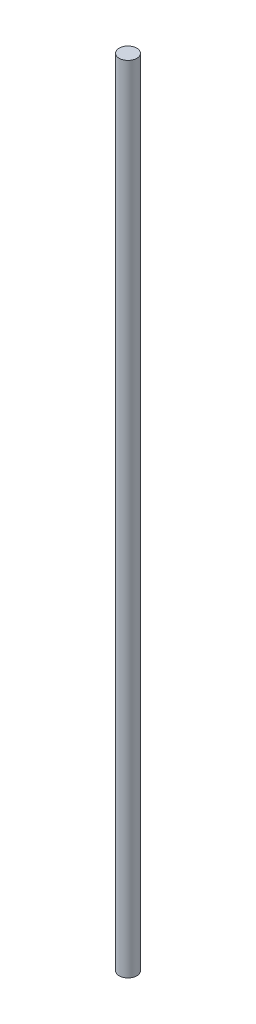
ISO-10303-21;
HEADER;
FILE_DESCRIPTION(('STEP AP214'),'2;1');
FILE_NAME('part.step','',(''),(''),'','','');
FILE_SCHEMA(('AUTOMOTIVE_DESIGN { 1 0 10303 214 1 1 1 1 }'));
ENDSEC;
DATA;
#1=APPLICATION_CONTEXT('core data for automotive mechanical design processes');
#2=APPLICATION_PROTOCOL_DEFINITION('international standard','automotive_design',2000,#1);
#3=PRODUCT_CONTEXT('',#1,'mechanical');
#4=PRODUCT('Part','Part','',(#3));
#5=PRODUCT_RELATED_PRODUCT_CATEGORY('part','',(#4));
#6=PRODUCT_DEFINITION_FORMATION('','',#4);
#7=PRODUCT_DEFINITION_CONTEXT('part definition',#1,'design');
#8=PRODUCT_DEFINITION('design','',#6,#7);
#9=PRODUCT_DEFINITION_SHAPE('','',#8);
#10=(LENGTH_UNIT() NAMED_UNIT(*) SI_UNIT(.MILLI.,.METRE.));
#11=(NAMED_UNIT(*) PLANE_ANGLE_UNIT() SI_UNIT($,.RADIAN.));
#12=(NAMED_UNIT(*) SI_UNIT($,.STERADIAN.) SOLID_ANGLE_UNIT());
#13=UNCERTAINTY_MEASURE_WITH_UNIT(LENGTH_MEASURE(1.E-05),#10,'distance_accuracy_value','');
#14=(GEOMETRIC_REPRESENTATION_CONTEXT(3) GLOBAL_UNCERTAINTY_ASSIGNED_CONTEXT((#13)) GLOBAL_UNIT_ASSIGNED_CONTEXT((#10,
#11,#12)) REPRESENTATION_CONTEXT('',''));
#15=CARTESIAN_POINT('',(0.,0.,0.));
#16=DIRECTION('',(0.,0.,1.));
#17=DIRECTION('',(1.,0.,0.));
#18=AXIS2_PLACEMENT_3D('',#15,#16,#17);
#19=CARTESIAN_POINT('',(0.,-180.,0.));
#20=DIRECTION('',(0.,1.,0.));
#21=DIRECTION('',(0.,0.,1.));
#22=AXIS2_PLACEMENT_3D('',#19,#20,#21);
#23=CYLINDRICAL_SURFACE('',#22,4.);
#24=CARTESIAN_POINT('',(0.,-180.,0.));
#25=DIRECTION('',(0.,1.,0.));
#26=DIRECTION('',(0.,0.,1.));
#27=AXIS2_PLACEMENT_3D('',#24,#25,#26);
#28=CIRCLE('',#27,4.);
#29=CARTESIAN_POINT('',(0.,-180.,4.));
#30=VERTEX_POINT('',#29);
#31=EDGE_CURVE('E10',#30,#30,#28,.T.);
#32=CARTESIAN_POINT('',(0.,180.,0.));
#33=DIRECTION('',(0.,1.,0.));
#34=DIRECTION('',(0.,0.,1.));
#35=AXIS2_PLACEMENT_3D('',#32,#33,#34);
#36=CIRCLE('',#35,4.);
#37=CARTESIAN_POINT('',(0.,180.,4.));
#38=VERTEX_POINT('',#37);
#39=EDGE_CURVE('E43',#38,#38,#36,.T.);
#40=CARTESIAN_POINT('',(0.,-180.,4.));
#41=CARTESIAN_POINT('',(0.,-176.25,4.));
#42=CARTESIAN_POINT('',(0.,-172.5,4.));
#43=CARTESIAN_POINT('',(0.,-165.,4.));
#44=CARTESIAN_POINT('',(0.,-161.25,4.));
#45=CARTESIAN_POINT('',(0.,-153.75,4.));
#46=CARTESIAN_POINT('',(0.,-150.,4.));
#47=CARTESIAN_POINT('',(0.,-142.5,4.));
#48=CARTESIAN_POINT('',(0.,-138.75,4.));
#49=CARTESIAN_POINT('',(0.,-131.25,4.));
#50=CARTESIAN_POINT('',(0.,-127.5,4.));
#51=CARTESIAN_POINT('',(0.,-120.,4.));
#52=CARTESIAN_POINT('',(0.,-116.25,4.));
#53=CARTESIAN_POINT('',(0.,-108.75,4.));
#54=CARTESIAN_POINT('',(0.,-105.,4.));
#55=CARTESIAN_POINT('',(0.,-97.5,4.));
#56=CARTESIAN_POINT('',(0.,-93.75,4.));
#57=CARTESIAN_POINT('',(0.,-86.25,4.));
#58=CARTESIAN_POINT('',(0.,-82.5,4.));
#59=CARTESIAN_POINT('',(0.,-75.,4.));
#60=CARTESIAN_POINT('',(0.,-71.25,4.));
#61=CARTESIAN_POINT('',(0.,-63.75,4.));
#62=CARTESIAN_POINT('',(0.,-60.,4.));
#63=CARTESIAN_POINT('',(0.,-52.5,4.));
#64=CARTESIAN_POINT('',(0.,-48.75,4.));
#65=CARTESIAN_POINT('',(0.,-41.25,4.));
#66=CARTESIAN_POINT('',(0.,-37.5000000000001,4.));
#67=CARTESIAN_POINT('',(0.,-30.0000000000001,4.));
#68=CARTESIAN_POINT('',(0.,-26.25,4.));
#69=CARTESIAN_POINT('',(0.,-18.7500000000001,4.));
#70=CARTESIAN_POINT('',(0.,-15.0000000000001,4.));
#71=CARTESIAN_POINT('',(0.,-7.50000000000006,4.));
#72=CARTESIAN_POINT('',(0.,-3.75000000000006,4.));
#73=CARTESIAN_POINT('',(0.,3.74999999999995,4.));
#74=CARTESIAN_POINT('',(0.,7.49999999999995,4.));
#75=CARTESIAN_POINT('',(0.,14.9999999999999,4.));
#76=CARTESIAN_POINT('',(0.,18.7499999999999,4.));
#77=CARTESIAN_POINT('',(0.,26.2499999999999,4.));
#78=CARTESIAN_POINT('',(0.,29.9999999999999,4.));
#79=CARTESIAN_POINT('',(0.,37.4999999999999,4.));
#80=CARTESIAN_POINT('',(0.,41.2499999999999,4.));
#81=CARTESIAN_POINT('',(0.,48.7499999999999,4.));
#82=CARTESIAN_POINT('',(0.,52.4999999999999,4.));
#83=CARTESIAN_POINT('',(0.,59.9999999999999,4.));
#84=CARTESIAN_POINT('',(0.,63.7499999999999,4.));
#85=CARTESIAN_POINT('',(0.,71.2499999999999,4.));
#86=CARTESIAN_POINT('',(0.,74.9999999999999,4.));
#87=CARTESIAN_POINT('',(0.,82.4999999999999,4.));
#88=CARTESIAN_POINT('',(0.,86.25,4.));
#89=CARTESIAN_POINT('',(0.,93.75,4.));
#90=CARTESIAN_POINT('',(0.,97.5,4.));
#91=CARTESIAN_POINT('',(0.,105.,4.));
#92=CARTESIAN_POINT('',(0.,108.75,4.));
#93=CARTESIAN_POINT('',(0.,116.25,4.));
#94=CARTESIAN_POINT('',(0.,120.,4.));
#95=CARTESIAN_POINT('',(0.,127.5,4.));
#96=CARTESIAN_POINT('',(0.,131.25,4.));
#97=CARTESIAN_POINT('',(0.,138.75,4.));
#98=CARTESIAN_POINT('',(0.,142.5,4.));
#99=CARTESIAN_POINT('',(0.,150.,4.));
#100=CARTESIAN_POINT('',(0.,153.75,4.));
#101=CARTESIAN_POINT('',(0.,161.25,4.));
#102=CARTESIAN_POINT('',(0.,165.,4.));
#103=CARTESIAN_POINT('',(0.,172.5,4.));
#104=CARTESIAN_POINT('',(0.,176.25,4.));
#105=CARTESIAN_POINT('',(0.,180.,4.));
#106=B_SPLINE_CURVE_WITH_KNOTS('',3,(#40,#41,#42,#43,#44,#45,#46,#47,#48,#49,#50,#51,#52,#53,
#54,#55,#56,#57,#58,#59,#60,#61,#62,#63,#64,#65,#66,#67,#68,#69,#70,#71,#72,#73,#74,#75,#76,#77,
#78,#79,#80,#81,#82,#83,#84,#85,#86,#87,#88,#89,#90,#91,#92,#93,#94,#95,#96,#97,#98,#99,#100,
#101,#102,#103,#104,#105),.UNSPECIFIED.,.F.,.F.,(4,2,2,2,2,2,2,2,2,2,2,2,2,2,2,2,2,2,2,2,2,2,2,
2,2,2,2,2,2,2,2,2,4),(0.,11.25,22.5,33.75,45.,56.25,67.5,78.75,90.,101.25,112.5,123.75,135.,
146.25,157.5,168.75,180.,191.25,202.5,213.75,225.,236.25,247.5,258.75,270.,281.25,292.5,303.75,
315.,326.25,337.5,348.75,360.),.UNSPECIFIED.);
#107=EDGE_CURVE('BSEAM37',#30,#38,#106,.T.);
#108=ORIENTED_EDGE('',*,*,#31,.T.);
#109=ORIENTED_EDGE('',*,*,#39,.F.);
#110=ORIENTED_EDGE('',*,*,#107,.T.);
#111=ORIENTED_EDGE('',*,*,#107,.F.);
#112=EDGE_LOOP('',(#108,#110,#109,#111));
#113=FACE_BOUND('',#112,.T.);
#114=ADVANCED_FACE('F37',(#113),#23,.T.);
#115=CARTESIAN_POINT('',(0.,-180.,0.));
#116=DIRECTION('',(0.,1.,0.));
#117=DIRECTION('',(0.,0.,1.));
#118=AXIS2_PLACEMENT_3D('',#115,#116,#117);
#119=PLANE('',#118);
#120=ORIENTED_EDGE('',*,*,#31,.F.);
#121=EDGE_LOOP('',(#120));
#122=FACE_BOUND('',#121,.T.);
#123=ADVANCED_FACE('F52',(#122),#119,.F.);
#124=CARTESIAN_POINT('',(0.,180.,0.));
#125=DIRECTION('',(0.,1.,0.));
#126=DIRECTION('',(0.,0.,1.));
#127=AXIS2_PLACEMENT_3D('',#124,#125,#126);
#128=PLANE('',#127);
#129=ORIENTED_EDGE('',*,*,#39,.T.);
#130=EDGE_LOOP('',(#129));
#131=FACE_BOUND('',#130,.T.);
#132=ADVANCED_FACE('F49',(#131),#128,.T.);
#133=CLOSED_SHELL('',(#114,#123,#132));
#134=MANIFOLD_SOLID_BREP('B2',#133);
#135=ADVANCED_BREP_SHAPE_REPRESENTATION('',(#18,#134),#14);
#136=SHAPE_DEFINITION_REPRESENTATION(#9,#135);
ENDSEC;
END-ISO-10303-21;
